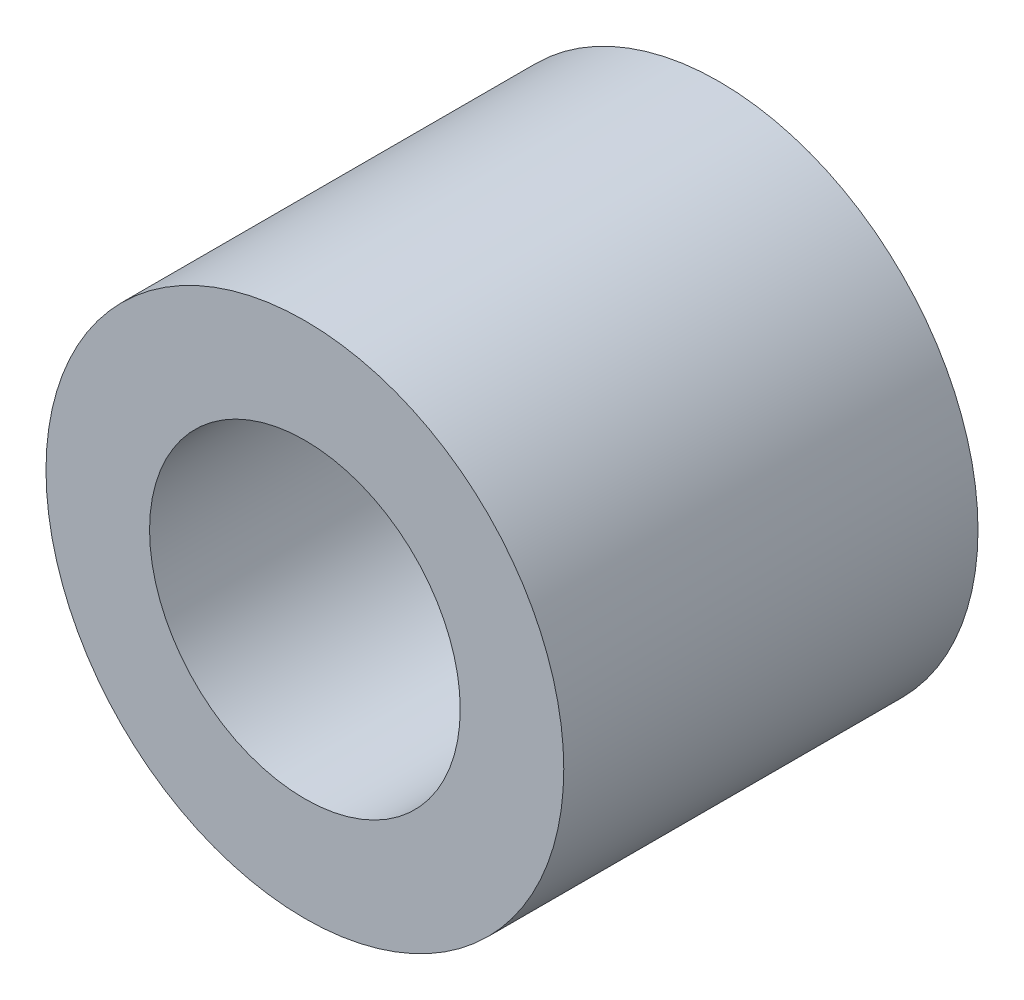
ISO-10303-21;
HEADER;
FILE_DESCRIPTION(('STEP AP214'),'2;1');
FILE_NAME('part.step','',(''),(''),'','','');
FILE_SCHEMA(('AUTOMOTIVE_DESIGN { 1 0 10303 214 1 1 1 1 }'));
ENDSEC;
DATA;
#1=APPLICATION_CONTEXT('core data for automotive mechanical design processes');
#2=APPLICATION_PROTOCOL_DEFINITION('international standard','automotive_design',2000,#1);
#3=PRODUCT_CONTEXT('',#1,'mechanical');
#4=PRODUCT('Part','Part','',(#3));
#5=PRODUCT_RELATED_PRODUCT_CATEGORY('part','',(#4));
#6=PRODUCT_DEFINITION_FORMATION('','',#4);
#7=PRODUCT_DEFINITION_CONTEXT('part definition',#1,'design');
#8=PRODUCT_DEFINITION('design','',#6,#7);
#9=PRODUCT_DEFINITION_SHAPE('','',#8);
#10=(LENGTH_UNIT() NAMED_UNIT(*) SI_UNIT(.MILLI.,.METRE.));
#11=(NAMED_UNIT(*) PLANE_ANGLE_UNIT() SI_UNIT($,.RADIAN.));
#12=(NAMED_UNIT(*) SI_UNIT($,.STERADIAN.) SOLID_ANGLE_UNIT());
#13=UNCERTAINTY_MEASURE_WITH_UNIT(LENGTH_MEASURE(1.E-05),#10,'distance_accuracy_value','');
#14=(GEOMETRIC_REPRESENTATION_CONTEXT(3) GLOBAL_UNCERTAINTY_ASSIGNED_CONTEXT((#13)) GLOBAL_UNIT_ASSIGNED_CONTEXT((#10,
#11,#12)) REPRESENTATION_CONTEXT('',''));
#15=CARTESIAN_POINT('',(0.,0.,0.));
#16=DIRECTION('',(0.,0.,1.));
#17=DIRECTION('',(1.,0.,0.));
#18=AXIS2_PLACEMENT_3D('',#15,#16,#17);
#19=CARTESIAN_POINT('',(0.,0.,5.08));
#20=DIRECTION('',(0.,0.,1.));
#21=DIRECTION('',(1.,0.,0.));
#22=AXIS2_PLACEMENT_3D('',#19,#20,#21);
#23=PLANE('',#22);
#24=CARTESIAN_POINT('',(0.,0.,5.08));
#25=DIRECTION('',(0.,0.,1.));
#26=DIRECTION('',(1.,0.,0.));
#27=AXIS2_PLACEMENT_3D('',#24,#25,#26);
#28=CIRCLE('',#27,3.175);
#29=CARTESIAN_POINT('',(3.175,0.,5.08));
#30=VERTEX_POINT('',#29);
#31=EDGE_CURVE('E10',#30,#30,#28,.T.);
#32=ORIENTED_EDGE('',*,*,#31,.T.);
#33=EDGE_LOOP('',(#32));
#34=FACE_BOUND('',#33,.T.);
#35=CARTESIAN_POINT('',(0.,0.,5.08));
#36=DIRECTION('',(0.,0.,1.));
#37=DIRECTION('',(1.,0.,0.));
#38=AXIS2_PLACEMENT_3D('',#35,#36,#37);
#39=CIRCLE('',#38,1.905);
#40=CARTESIAN_POINT('',(1.905,0.,5.08));
#41=VERTEX_POINT('',#40);
#42=EDGE_CURVE('E44',#41,#41,#39,.T.);
#43=ORIENTED_EDGE('',*,*,#42,.F.);
#44=EDGE_LOOP('',(#43));
#45=FACE_BOUND('',#44,.T.);
#46=ADVANCED_FACE('F33',(#34,#45),#23,.T.);
#47=CARTESIAN_POINT('',(0.,0.,0.));
#48=DIRECTION('',(0.,0.,1.));
#49=DIRECTION('',(1.,0.,0.));
#50=AXIS2_PLACEMENT_3D('',#47,#48,#49);
#51=PLANE('',#50);
#52=CARTESIAN_POINT('',(0.,0.,0.));
#53=DIRECTION('',(0.,0.,1.));
#54=DIRECTION('',(1.,0.,0.));
#55=AXIS2_PLACEMENT_3D('',#52,#53,#54);
#56=CIRCLE('',#55,3.175);
#57=CARTESIAN_POINT('',(3.175,0.,0.));
#58=VERTEX_POINT('',#57);
#59=EDGE_CURVE('E37',#58,#58,#56,.T.);
#60=ORIENTED_EDGE('',*,*,#59,.F.);
#61=EDGE_LOOP('',(#60));
#62=FACE_BOUND('',#61,.T.);
#63=CARTESIAN_POINT('',(0.,0.,0.));
#64=DIRECTION('',(0.,0.,1.));
#65=DIRECTION('',(1.,0.,0.));
#66=AXIS2_PLACEMENT_3D('',#63,#64,#65);
#67=CIRCLE('',#66,1.905);
#68=CARTESIAN_POINT('',(1.905,0.,0.));
#69=VERTEX_POINT('',#68);
#70=EDGE_CURVE('E46',#69,#69,#67,.T.);
#71=ORIENTED_EDGE('',*,*,#70,.T.);
#72=EDGE_LOOP('',(#71));
#73=FACE_BOUND('',#72,.T.);
#74=ADVANCED_FACE('F56',(#62,#73),#51,.F.);
#75=CARTESIAN_POINT('',(0.,0.,5.08));
#76=DIRECTION('',(0.,0.,-1.));
#77=DIRECTION('',(-1.,0.,0.));
#78=AXIS2_PLACEMENT_3D('',#75,#76,#77);
#79=CYLINDRICAL_SURFACE('',#78,3.175);
#80=ORIENTED_EDGE('',*,*,#31,.F.);
#81=EDGE_LOOP('',(#80));
#82=FACE_BOUND('',#81,.T.);
#83=ORIENTED_EDGE('',*,*,#59,.T.);
#84=EDGE_LOOP('',(#83));
#85=FACE_BOUND('',#84,.T.);
#86=ADVANCED_FACE('F35',(#82,#85),#79,.T.);
#87=CARTESIAN_POINT('',(0.,0.,5.08));
#88=DIRECTION('',(0.,0.,-1.));
#89=DIRECTION('',(-1.,0.,0.));
#90=AXIS2_PLACEMENT_3D('',#87,#88,#89);
#91=CYLINDRICAL_SURFACE('',#90,1.905);
#92=ORIENTED_EDGE('',*,*,#42,.T.);
#93=EDGE_LOOP('',(#92));
#94=FACE_BOUND('',#93,.T.);
#95=ORIENTED_EDGE('',*,*,#70,.F.);
#96=EDGE_LOOP('',(#95));
#97=FACE_BOUND('',#96,.T.);
#98=ADVANCED_FACE('F52',(#94,#97),#91,.F.);
#99=CLOSED_SHELL('',(#46,#74,#86,#98));
#100=MANIFOLD_SOLID_BREP('B2',#99);
#101=ADVANCED_BREP_SHAPE_REPRESENTATION('',(#18,#100),#14);
#102=SHAPE_DEFINITION_REPRESENTATION(#9,#101);
ENDSEC;
END-ISO-10303-21;
